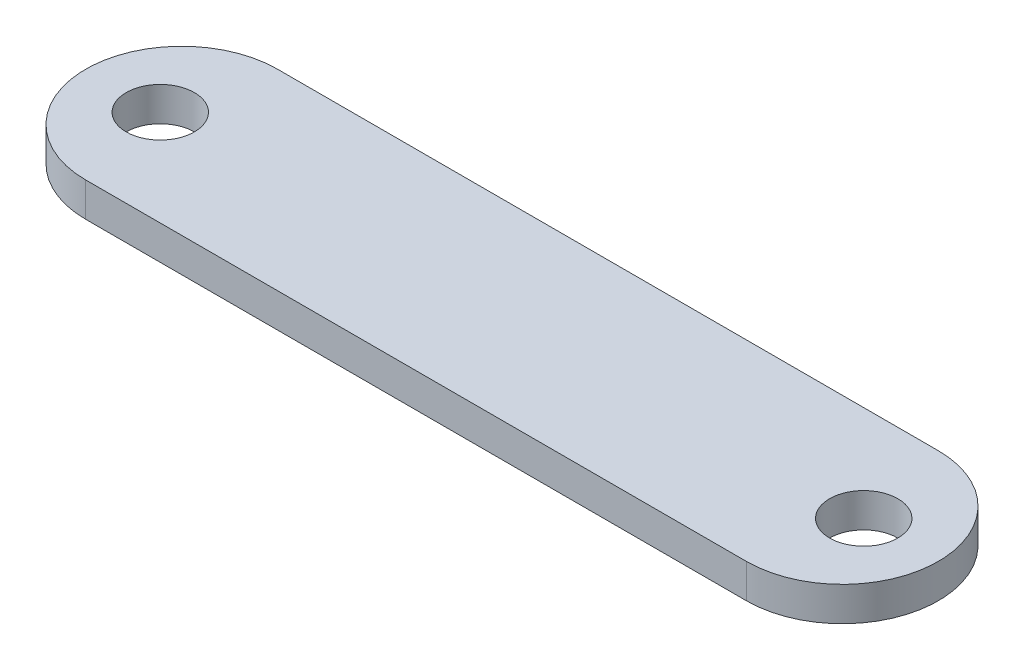
ISO-10303-21;
HEADER;
FILE_DESCRIPTION(('STEP AP214'),'2;1');
FILE_NAME('part.step','',(''),(''),'','','');
FILE_SCHEMA(('AUTOMOTIVE_DESIGN { 1 0 10303 214 1 1 1 1 }'));
ENDSEC;
DATA;
#1=APPLICATION_CONTEXT('core data for automotive mechanical design processes');
#2=APPLICATION_PROTOCOL_DEFINITION('international standard','automotive_design',2000,#1);
#3=PRODUCT_CONTEXT('',#1,'mechanical');
#4=PRODUCT('Part','Part','',(#3));
#5=PRODUCT_RELATED_PRODUCT_CATEGORY('part','',(#4));
#6=PRODUCT_DEFINITION_FORMATION('','',#4);
#7=PRODUCT_DEFINITION_CONTEXT('part definition',#1,'design');
#8=PRODUCT_DEFINITION('design','',#6,#7);
#9=PRODUCT_DEFINITION_SHAPE('','',#8);
#10=(LENGTH_UNIT() NAMED_UNIT(*) SI_UNIT(.MILLI.,.METRE.));
#11=(NAMED_UNIT(*) PLANE_ANGLE_UNIT() SI_UNIT($,.RADIAN.));
#12=(NAMED_UNIT(*) SI_UNIT($,.STERADIAN.) SOLID_ANGLE_UNIT());
#13=UNCERTAINTY_MEASURE_WITH_UNIT(LENGTH_MEASURE(1.E-05),#10,'distance_accuracy_value','');
#14=(GEOMETRIC_REPRESENTATION_CONTEXT(3) GLOBAL_UNCERTAINTY_ASSIGNED_CONTEXT((#13)) GLOBAL_UNIT_ASSIGNED_CONTEXT((#10,
#11,#12)) REPRESENTATION_CONTEXT('',''));
#15=CARTESIAN_POINT('',(0.,0.,0.));
#16=DIRECTION('',(0.,0.,1.));
#17=DIRECTION('',(1.,0.,0.));
#18=AXIS2_PLACEMENT_3D('',#15,#16,#17);
#19=CARTESIAN_POINT('',(-15.5,1.6,0.));
#20=DIRECTION('',(0.,1.,0.));
#21=DIRECTION('',(0.,0.,1.));
#22=AXIS2_PLACEMENT_3D('',#19,#20,#21);
#23=PLANE('',#22);
#24=CARTESIAN_POINT('',(-16.5,1.6,0.));
#25=DIRECTION('',(0.,1.,0.));
#26=DIRECTION('',(0.,0.,1.));
#27=AXIS2_PLACEMENT_3D('',#24,#25,#26);
#28=CIRCLE('',#27,1.6);
#29=CARTESIAN_POINT('',(-16.5,1.6,1.6));
#30=VERTEX_POINT('',#29);
#31=EDGE_CURVE('E100',#30,#30,#28,.T.);
#32=ORIENTED_EDGE('',*,*,#31,.F.);
#33=EDGE_LOOP('',(#32));
#34=FACE_BOUND('',#33,.T.);
#35=CARTESIAN_POINT('',(-15.5,1.6,0.));
#36=DIRECTION('',(0.,1.,0.));
#37=DIRECTION('',(0.,0.,1.));
#38=AXIS2_PLACEMENT_3D('',#35,#36,#37);
#39=CIRCLE('',#38,4.5);
#40=CARTESIAN_POINT('',(-15.5,1.6,-4.5));
#41=VERTEX_POINT('',#40);
#42=CARTESIAN_POINT('',(-15.5,1.6,4.5));
#43=VERTEX_POINT('',#42);
#44=EDGE_CURVE('E85',#41,#43,#39,.T.);
#45=ORIENTED_EDGE('',*,*,#44,.T.);
#46=DIRECTION('',(1.,0.,0.));
#47=VECTOR('',#46,1.);
#48=CARTESIAN_POINT('',(-15.5,1.6,4.5));
#49=LINE('',#48,#47);
#50=CARTESIAN_POINT('',(15.5,1.6,4.5));
#51=VERTEX_POINT('',#50);
#52=EDGE_CURVE('E80',#43,#51,#49,.T.);
#53=ORIENTED_EDGE('',*,*,#52,.T.);
#54=CARTESIAN_POINT('',(15.5,1.6,0.));
#55=DIRECTION('',(0.,1.,0.));
#56=DIRECTION('',(0.,0.,1.));
#57=AXIS2_PLACEMENT_3D('',#54,#55,#56);
#58=CIRCLE('',#57,4.5);
#59=CARTESIAN_POINT('',(15.5,1.6,-4.5));
#60=VERTEX_POINT('',#59);
#61=EDGE_CURVE('E83',#51,#60,#58,.T.);
#62=ORIENTED_EDGE('',*,*,#61,.T.);
#63=DIRECTION('',(-1.,0.,0.));
#64=VECTOR('',#63,1.);
#65=CARTESIAN_POINT('',(-15.5,1.6,-4.5));
#66=LINE('',#65,#64);
#67=EDGE_CURVE('E50',#60,#41,#66,.T.);
#68=ORIENTED_EDGE('',*,*,#67,.T.);
#69=EDGE_LOOP('',(#45,#53,#62,#68));
#70=FACE_BOUND('',#69,.T.);
#71=CARTESIAN_POINT('',(16.5,1.6,0.));
#72=DIRECTION('',(0.,1.,0.));
#73=DIRECTION('',(0.,0.,-1.));
#74=AXIS2_PLACEMENT_3D('',#71,#72,#73);
#75=CIRCLE('',#74,1.6);
#76=CARTESIAN_POINT('',(16.5,1.6,-1.60000000000001));
#77=VERTEX_POINT('',#76);
#78=EDGE_CURVE('E115',#77,#77,#75,.T.);
#79=ORIENTED_EDGE('',*,*,#78,.F.);
#80=EDGE_LOOP('',(#79));
#81=FACE_BOUND('',#80,.T.);
#82=ADVANCED_FACE('F33',(#34,#70,#81),#23,.T.);
#83=CARTESIAN_POINT('',(-15.5,0.,0.));
#84=DIRECTION('',(0.,1.,0.));
#85=DIRECTION('',(0.,0.,1.));
#86=AXIS2_PLACEMENT_3D('',#83,#84,#85);
#87=PLANE('',#86);
#88=CARTESIAN_POINT('',(-15.5,0.,0.));
#89=DIRECTION('',(0.,1.,0.));
#90=DIRECTION('',(0.,0.,1.));
#91=AXIS2_PLACEMENT_3D('',#88,#89,#90);
#92=CIRCLE('',#91,4.5);
#93=CARTESIAN_POINT('',(-15.5,0.,-4.5));
#94=VERTEX_POINT('',#93);
#95=CARTESIAN_POINT('',(-15.5,0.,4.5));
#96=VERTEX_POINT('',#95);
#97=EDGE_CURVE('E97',#94,#96,#92,.T.);
#98=ORIENTED_EDGE('',*,*,#97,.F.);
#99=DIRECTION('',(-1.,0.,0.));
#100=VECTOR('',#99,1.);
#101=CARTESIAN_POINT('',(-15.5,0.,-4.5));
#102=LINE('',#101,#100);
#103=CARTESIAN_POINT('',(15.5,0.,-4.5));
#104=VERTEX_POINT('',#103);
#105=EDGE_CURVE('E73',#104,#94,#102,.T.);
#106=ORIENTED_EDGE('',*,*,#105,.F.);
#107=CARTESIAN_POINT('',(15.5,0.,0.));
#108=DIRECTION('',(0.,1.,0.));
#109=DIRECTION('',(0.,0.,1.));
#110=AXIS2_PLACEMENT_3D('',#107,#108,#109);
#111=CIRCLE('',#110,4.5);
#112=CARTESIAN_POINT('',(15.5,0.,4.5));
#113=VERTEX_POINT('',#112);
#114=EDGE_CURVE('E67',#113,#104,#111,.T.);
#115=ORIENTED_EDGE('',*,*,#114,.F.);
#116=DIRECTION('',(1.,0.,0.));
#117=VECTOR('',#116,1.);
#118=CARTESIAN_POINT('',(-15.5,0.,4.5));
#119=LINE('',#118,#117);
#120=EDGE_CURVE('E89',#96,#113,#119,.T.);
#121=ORIENTED_EDGE('',*,*,#120,.F.);
#122=EDGE_LOOP('',(#98,#106,#115,#121));
#123=FACE_BOUND('',#122,.T.);
#124=CARTESIAN_POINT('',(-16.5,0.,0.));
#125=DIRECTION('',(0.,1.,0.));
#126=DIRECTION('',(0.,0.,1.));
#127=AXIS2_PLACEMENT_3D('',#124,#125,#126);
#128=CIRCLE('',#127,1.6);
#129=CARTESIAN_POINT('',(-16.5,0.,1.6));
#130=VERTEX_POINT('',#129);
#131=EDGE_CURVE('E112',#130,#130,#128,.T.);
#132=ORIENTED_EDGE('',*,*,#131,.T.);
#133=EDGE_LOOP('',(#132));
#134=FACE_BOUND('',#133,.T.);
#135=CARTESIAN_POINT('',(16.5,0.,0.));
#136=DIRECTION('',(0.,1.,0.));
#137=DIRECTION('',(0.,0.,-1.));
#138=AXIS2_PLACEMENT_3D('',#135,#136,#137);
#139=CIRCLE('',#138,1.6);
#140=CARTESIAN_POINT('',(16.5,0.,-1.60000000000001));
#141=VERTEX_POINT('',#140);
#142=EDGE_CURVE('E118',#141,#141,#139,.T.);
#143=ORIENTED_EDGE('',*,*,#142,.T.);
#144=EDGE_LOOP('',(#143));
#145=FACE_BOUND('',#144,.T.);
#146=ADVANCED_FACE('F108',(#123,#134,#145),#87,.F.);
#147=CARTESIAN_POINT('',(-15.5,1.6,0.));
#148=DIRECTION('',(0.,-1.,0.));
#149=DIRECTION('',(0.,0.,-1.));
#150=AXIS2_PLACEMENT_3D('',#147,#148,#149);
#151=CYLINDRICAL_SURFACE('',#150,4.5);
#152=ORIENTED_EDGE('',*,*,#97,.T.);
#153=DIRECTION('',(0.,-1.,0.));
#154=VECTOR('',#153,1.);
#155=CARTESIAN_POINT('',(-15.5,1.6,4.5));
#156=LINE('',#155,#154);
#157=EDGE_CURVE('E11',#43,#96,#156,.T.);
#158=ORIENTED_EDGE('',*,*,#157,.F.);
#159=ORIENTED_EDGE('',*,*,#44,.F.);
#160=DIRECTION('',(0.,-1.,0.));
#161=VECTOR('',#160,1.);
#162=CARTESIAN_POINT('',(-15.5,1.6,-4.5));
#163=LINE('',#162,#161);
#164=EDGE_CURVE('E93',#41,#94,#163,.T.);
#165=ORIENTED_EDGE('',*,*,#164,.T.);
#166=EDGE_LOOP('',(#152,#158,#159,#165));
#167=FACE_BOUND('',#166,.T.);
#168=ADVANCED_FACE('F35',(#167),#151,.T.);
#169=CARTESIAN_POINT('',(-15.5,1.6,4.5));
#170=DIRECTION('',(0.,0.,-1.));
#171=DIRECTION('',(-1.,0.,0.));
#172=AXIS2_PLACEMENT_3D('',#169,#170,#171);
#173=PLANE('',#172);
#174=ORIENTED_EDGE('',*,*,#120,.T.);
#175=DIRECTION('',(0.,-1.,0.));
#176=VECTOR('',#175,1.);
#177=CARTESIAN_POINT('',(15.5,1.6,4.5));
#178=LINE('',#177,#176);
#179=EDGE_CURVE('E42',#51,#113,#178,.T.);
#180=ORIENTED_EDGE('',*,*,#179,.F.);
#181=ORIENTED_EDGE('',*,*,#52,.F.);
#182=ORIENTED_EDGE('',*,*,#157,.T.);
#183=EDGE_LOOP('',(#174,#180,#181,#182));
#184=FACE_BOUND('',#183,.T.);
#185=ADVANCED_FACE('F88',(#184),#173,.F.);
#186=CARTESIAN_POINT('',(15.5,1.6,0.));
#187=DIRECTION('',(0.,-1.,0.));
#188=DIRECTION('',(0.,0.,-1.));
#189=AXIS2_PLACEMENT_3D('',#186,#187,#188);
#190=CYLINDRICAL_SURFACE('',#189,4.5);
#191=ORIENTED_EDGE('',*,*,#114,.T.);
#192=DIRECTION('',(0.,-1.,0.));
#193=VECTOR('',#192,1.);
#194=CARTESIAN_POINT('',(15.5,1.6,-4.5));
#195=LINE('',#194,#193);
#196=EDGE_CURVE('E90',#60,#104,#195,.T.);
#197=ORIENTED_EDGE('',*,*,#196,.F.);
#198=ORIENTED_EDGE('',*,*,#61,.F.);
#199=ORIENTED_EDGE('',*,*,#179,.T.);
#200=EDGE_LOOP('',(#191,#197,#198,#199));
#201=FACE_BOUND('',#200,.T.);
#202=ADVANCED_FACE('F91',(#201),#190,.T.);
#203=CARTESIAN_POINT('',(-15.5,1.6,-4.5));
#204=DIRECTION('',(0.,0.,1.));
#205=DIRECTION('',(1.,0.,0.));
#206=AXIS2_PLACEMENT_3D('',#203,#204,#205);
#207=PLANE('',#206);
#208=ORIENTED_EDGE('',*,*,#105,.T.);
#209=ORIENTED_EDGE('',*,*,#164,.F.);
#210=ORIENTED_EDGE('',*,*,#67,.F.);
#211=ORIENTED_EDGE('',*,*,#196,.T.);
#212=EDGE_LOOP('',(#208,#209,#210,#211));
#213=FACE_BOUND('',#212,.T.);
#214=ADVANCED_FACE('F105',(#213),#207,.F.);
#215=CARTESIAN_POINT('',(-16.5,1.6,0.));
#216=DIRECTION('',(0.,-1.,0.));
#217=DIRECTION('',(0.,0.,-1.));
#218=AXIS2_PLACEMENT_3D('',#215,#216,#217);
#219=CYLINDRICAL_SURFACE('',#218,1.6);
#220=ORIENTED_EDGE('',*,*,#31,.T.);
#221=EDGE_LOOP('',(#220));
#222=FACE_BOUND('',#221,.T.);
#223=ORIENTED_EDGE('',*,*,#131,.F.);
#224=EDGE_LOOP('',(#223));
#225=FACE_BOUND('',#224,.T.);
#226=ADVANCED_FACE('F135',(#222,#225),#219,.F.);
#227=CARTESIAN_POINT('',(16.5,1.6,0.));
#228=DIRECTION('',(0.,-1.,0.));
#229=DIRECTION('',(0.,0.,-1.));
#230=AXIS2_PLACEMENT_3D('',#227,#228,#229);
#231=CYLINDRICAL_SURFACE('',#230,1.6);
#232=ORIENTED_EDGE('',*,*,#78,.T.);
#233=EDGE_LOOP('',(#232));
#234=FACE_BOUND('',#233,.T.);
#235=ORIENTED_EDGE('',*,*,#142,.F.);
#236=EDGE_LOOP('',(#235));
#237=FACE_BOUND('',#236,.T.);
#238=ADVANCED_FACE('F124',(#234,#237),#231,.F.);
#239=CLOSED_SHELL('',(#82,#146,#168,#185,#202,#214,#226,#238));
#240=MANIFOLD_SOLID_BREP('B2',#239);
#241=ADVANCED_BREP_SHAPE_REPRESENTATION('',(#18,#240),#14);
#242=SHAPE_DEFINITION_REPRESENTATION(#9,#241);
ENDSEC;
END-ISO-10303-21;
